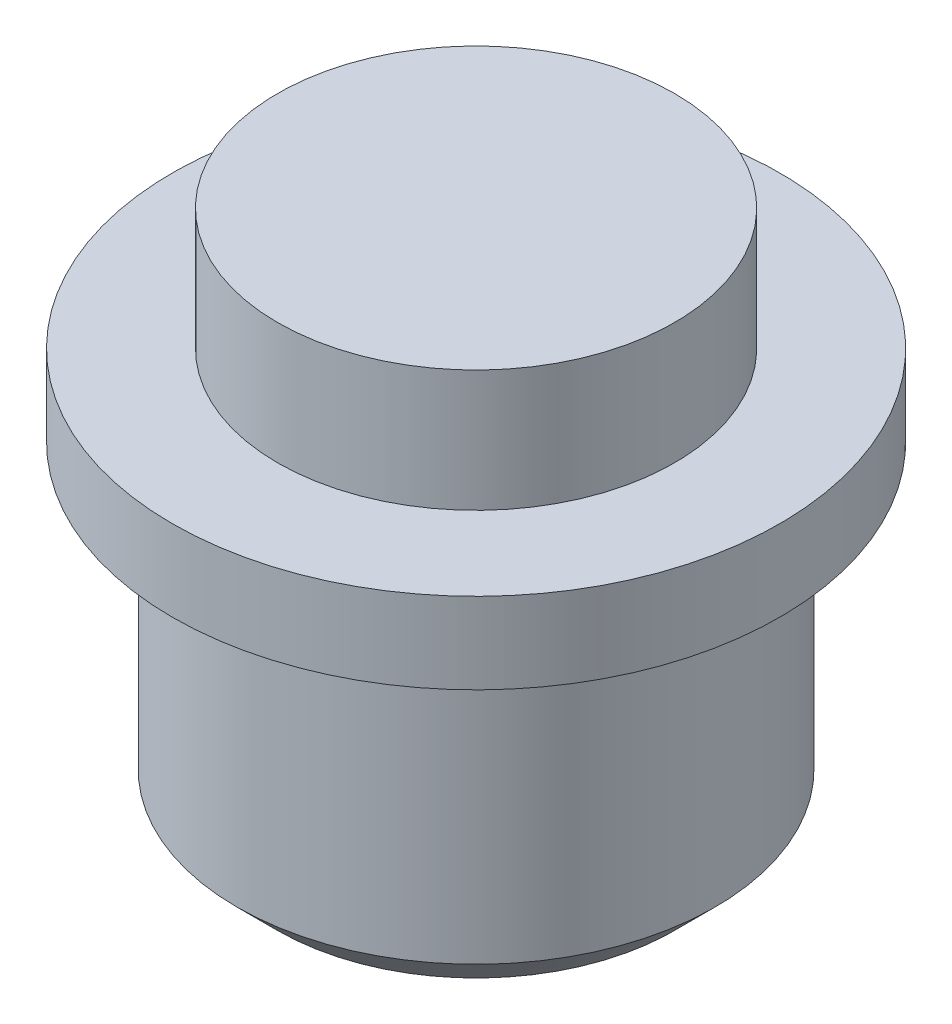
ISO-10303-21;
HEADER;
FILE_DESCRIPTION(('STEP AP214'),'2;1');
FILE_NAME('part.step','',(''),(''),'','','');
FILE_SCHEMA(('AUTOMOTIVE_DESIGN { 1 0 10303 214 1 1 1 1 }'));
ENDSEC;
DATA;
#1=APPLICATION_CONTEXT('core data for automotive mechanical design processes');
#2=APPLICATION_PROTOCOL_DEFINITION('international standard','automotive_design',2000,#1);
#3=PRODUCT_CONTEXT('',#1,'mechanical');
#4=PRODUCT('Part','Part','',(#3));
#5=PRODUCT_RELATED_PRODUCT_CATEGORY('part','',(#4));
#6=PRODUCT_DEFINITION_FORMATION('','',#4);
#7=PRODUCT_DEFINITION_CONTEXT('part definition',#1,'design');
#8=PRODUCT_DEFINITION('design','',#6,#7);
#9=PRODUCT_DEFINITION_SHAPE('','',#8);
#10=(LENGTH_UNIT() NAMED_UNIT(*) SI_UNIT(.MILLI.,.METRE.));
#11=(NAMED_UNIT(*) PLANE_ANGLE_UNIT() SI_UNIT($,.RADIAN.));
#12=(NAMED_UNIT(*) SI_UNIT($,.STERADIAN.) SOLID_ANGLE_UNIT());
#13=UNCERTAINTY_MEASURE_WITH_UNIT(LENGTH_MEASURE(1.E-05),#10,'distance_accuracy_value','');
#14=(GEOMETRIC_REPRESENTATION_CONTEXT(3) GLOBAL_UNCERTAINTY_ASSIGNED_CONTEXT((#13)) GLOBAL_UNIT_ASSIGNED_CONTEXT((#10,
#11,#12)) REPRESENTATION_CONTEXT('',''));
#15=CARTESIAN_POINT('',(0.,0.,0.));
#16=DIRECTION('',(0.,0.,1.));
#17=DIRECTION('',(1.,0.,0.));
#18=AXIS2_PLACEMENT_3D('',#15,#16,#17);
#19=CARTESIAN_POINT('',(0.,5.,0.));
#20=DIRECTION('',(0.,-1.,0.));
#21=DIRECTION('',(0.,0.,-1.));
#22=AXIS2_PLACEMENT_3D('',#19,#20,#21);
#23=CYLINDRICAL_SURFACE('',#22,4.9);
#24=CARTESIAN_POINT('',(0.,1.999999904,0.));
#25=DIRECTION('',(0.,1.,0.));
#26=DIRECTION('',(0.,0.,1.));
#27=AXIS2_PLACEMENT_3D('',#24,#25,#26);
#28=CIRCLE('',#27,4.9);
#29=CARTESIAN_POINT('',(0.,1.999999904,4.9));
#30=VERTEX_POINT('',#29);
#31=EDGE_CURVE('E50',#30,#30,#28,.T.);
#32=ORIENTED_EDGE('',*,*,#31,.T.);
#33=EDGE_LOOP('',(#32));
#34=FACE_BOUND('',#33,.T.);
#35=CARTESIAN_POINT('',(0.,5.,0.));
#36=DIRECTION('',(0.,1.,0.));
#37=DIRECTION('',(0.,0.,1.));
#38=AXIS2_PLACEMENT_3D('',#35,#36,#37);
#39=CIRCLE('',#38,4.9);
#40=CARTESIAN_POINT('',(0.,5.,4.9));
#41=VERTEX_POINT('',#40);
#42=EDGE_CURVE('E46',#41,#41,#39,.T.);
#43=ORIENTED_EDGE('',*,*,#42,.F.);
#44=EDGE_LOOP('',(#43));
#45=FACE_BOUND('',#44,.T.);
#46=ADVANCED_FACE('F34',(#34,#45),#23,.T.);
#47=CARTESIAN_POINT('',(0.,5.,0.));
#48=DIRECTION('',(0.,1.,0.));
#49=DIRECTION('',(0.,0.,1.));
#50=AXIS2_PLACEMENT_3D('',#47,#48,#49);
#51=PLANE('',#50);
#52=ORIENTED_EDGE('',*,*,#42,.T.);
#53=EDGE_LOOP('',(#52));
#54=FACE_BOUND('',#53,.T.);
#55=ADVANCED_FACE('F81',(#54),#51,.T.);
#56=CARTESIAN_POINT('',(0.,-9.60000000500838E-08,0.));
#57=DIRECTION('',(0.,1.,0.));
#58=DIRECTION('',(0.,0.,1.));
#59=AXIS2_PLACEMENT_3D('',#56,#57,#58);
#60=CYLINDRICAL_SURFACE('',#59,7.5);
#61=CARTESIAN_POINT('',(0.,-9.60000000500838E-08,0.));
#62=DIRECTION('',(0.,1.,0.));
#63=DIRECTION('',(0.,0.,1.));
#64=AXIS2_PLACEMENT_3D('',#61,#62,#63);
#65=CIRCLE('',#64,7.5);
#66=CARTESIAN_POINT('',(0.,-9.60000000500838E-08,7.5));
#67=VERTEX_POINT('',#66);
#68=EDGE_CURVE('E54',#67,#67,#65,.T.);
#69=ORIENTED_EDGE('',*,*,#68,.T.);
#70=EDGE_LOOP('',(#69));
#71=FACE_BOUND('',#70,.T.);
#72=CARTESIAN_POINT('',(0.,1.999999904,0.));
#73=DIRECTION('',(0.,1.,0.));
#74=DIRECTION('',(0.,0.,1.));
#75=AXIS2_PLACEMENT_3D('',#72,#73,#74);
#76=CIRCLE('',#75,7.5);
#77=CARTESIAN_POINT('',(0.,1.999999904,7.5));
#78=VERTEX_POINT('',#77);
#79=EDGE_CURVE('E56',#78,#78,#76,.T.);
#80=ORIENTED_EDGE('',*,*,#79,.F.);
#81=EDGE_LOOP('',(#80));
#82=FACE_BOUND('',#81,.T.);
#83=ADVANCED_FACE('F86',(#71,#82),#60,.T.);
#84=CARTESIAN_POINT('',(0.,1.999999904,0.));
#85=DIRECTION('',(0.,1.,0.));
#86=DIRECTION('',(0.,0.,1.));
#87=AXIS2_PLACEMENT_3D('',#84,#85,#86);
#88=PLANE('',#87);
#89=ORIENTED_EDGE('',*,*,#31,.F.);
#90=EDGE_LOOP('',(#89));
#91=FACE_BOUND('',#90,.T.);
#92=ORIENTED_EDGE('',*,*,#79,.T.);
#93=EDGE_LOOP('',(#92));
#94=FACE_BOUND('',#93,.T.);
#95=ADVANCED_FACE('F77',(#91,#94),#88,.T.);
#96=CARTESIAN_POINT('',(0.,0.,0.));
#97=DIRECTION('',(0.,1.,0.));
#98=DIRECTION('',(0.,0.,1.));
#99=AXIS2_PLACEMENT_3D('',#96,#97,#98);
#100=PLANE('',#99);
#101=CARTESIAN_POINT('',(0.,0.,0.));
#102=DIRECTION('',(0.,1.,0.));
#103=DIRECTION('',(0.,0.,1.));
#104=AXIS2_PLACEMENT_3D('',#101,#102,#103);
#105=CIRCLE('',#104,5.9);
#106=CARTESIAN_POINT('',(0.,0.,5.9));
#107=VERTEX_POINT('',#106);
#108=EDGE_CURVE('E59',#107,#107,#105,.T.);
#109=ORIENTED_EDGE('',*,*,#108,.T.);
#110=EDGE_LOOP('',(#109));
#111=FACE_BOUND('',#110,.T.);
#112=ORIENTED_EDGE('',*,*,#68,.F.);
#113=EDGE_LOOP('',(#112));
#114=FACE_BOUND('',#113,.T.);
#115=ADVANCED_FACE('F65',(#111,#114),#100,.F.);
#116=CARTESIAN_POINT('',(0.,-8.,0.));
#117=DIRECTION('',(0.,1.,0.));
#118=DIRECTION('',(0.,0.,1.));
#119=AXIS2_PLACEMENT_3D('',#116,#117,#118);
#120=CYLINDRICAL_SURFACE('',#119,5.9);
#121=CARTESIAN_POINT('',(0.,-6.99999999999999,0.));
#122=DIRECTION('',(0.,1.,0.));
#123=DIRECTION('',(0.,0.,1.));
#124=AXIS2_PLACEMENT_3D('',#121,#122,#123);
#125=CIRCLE('',#124,5.9);
#126=CARTESIAN_POINT('',(0.,-6.99999999999999,5.9));
#127=VERTEX_POINT('',#126);
#128=EDGE_CURVE('E42',#127,#127,#125,.T.);
#129=ORIENTED_EDGE('',*,*,#128,.T.);
#130=EDGE_LOOP('',(#129));
#131=FACE_BOUND('',#130,.T.);
#132=ORIENTED_EDGE('',*,*,#108,.F.);
#133=EDGE_LOOP('',(#132));
#134=FACE_BOUND('',#133,.T.);
#135=ADVANCED_FACE('F68',(#131,#134),#120,.T.);
#136=CARTESIAN_POINT('',(0.,-8.,0.));
#137=DIRECTION('',(0.,1.,0.));
#138=DIRECTION('',(0.,0.,1.));
#139=AXIS2_PLACEMENT_3D('',#136,#137,#138);
#140=PLANE('',#139);
#141=CARTESIAN_POINT('',(0.,-8.,0.));
#142=DIRECTION('',(0.,1.,0.));
#143=DIRECTION('',(0.,0.,1.));
#144=AXIS2_PLACEMENT_3D('',#141,#142,#143);
#145=CIRCLE('',#144,4.89999999999998);
#146=CARTESIAN_POINT('',(0.,-8.,4.89999999999998));
#147=VERTEX_POINT('',#146);
#148=EDGE_CURVE('E10',#147,#147,#145,.F.);
#149=ORIENTED_EDGE('',*,*,#148,.T.);
#150=EDGE_LOOP('',(#149));
#151=FACE_BOUND('',#150,.T.);
#152=ADVANCED_FACE('F70',(#151),#140,.F.);
#153=CARTESIAN_POINT('',(0.,-6.99999999999999,0.));
#154=DIRECTION('',(0.,1.,0.));
#155=DIRECTION('',(0.,0.,1.));
#156=AXIS2_PLACEMENT_3D('',#153,#154,#155);
#157=CONICAL_SURFACE('',#156,5.9,0.785398163397453);
#158=ORIENTED_EDGE('',*,*,#148,.F.);
#159=EDGE_LOOP('',(#158));
#160=FACE_BOUND('',#159,.T.);
#161=ORIENTED_EDGE('',*,*,#128,.F.);
#162=EDGE_LOOP('',(#161));
#163=FACE_BOUND('',#162,.T.);
#164=ADVANCED_FACE('F37',(#160,#163),#157,.T.);
#165=CLOSED_SHELL('',(#46,#55,#83,#95,#115,#135,#152,#164));
#166=MANIFOLD_SOLID_BREP('B2',#165);
#167=ADVANCED_BREP_SHAPE_REPRESENTATION('',(#18,#166),#14);
#168=SHAPE_DEFINITION_REPRESENTATION(#9,#167);
ENDSEC;
END-ISO-10303-21;
